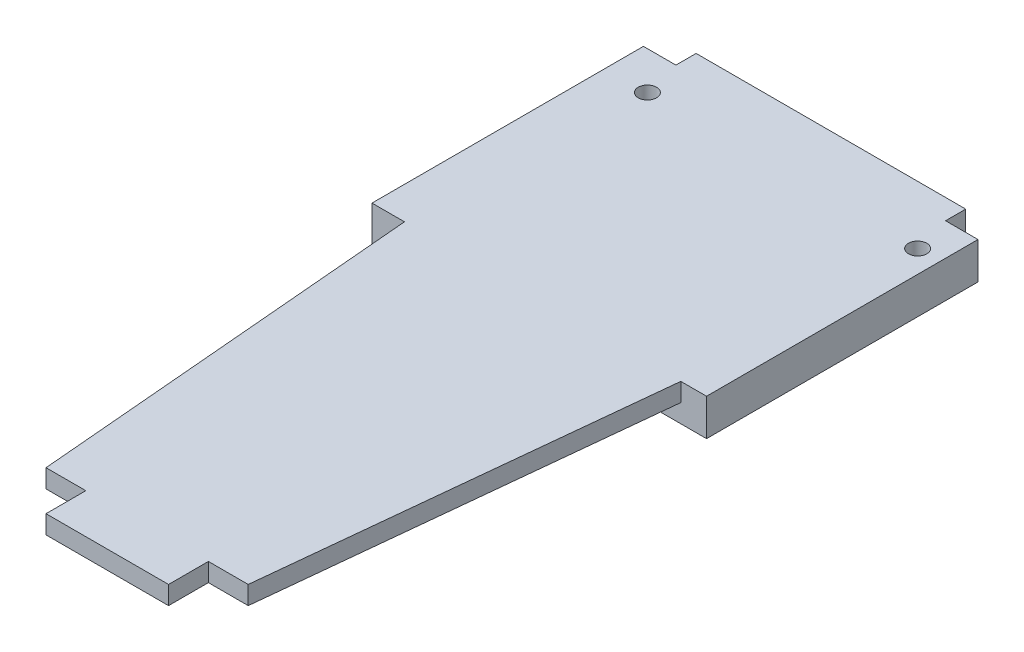
ISO-10303-21;
HEADER;
FILE_DESCRIPTION(('STEP AP214'),'2;1');
FILE_NAME('part.step','',(''),(''),'','','');
FILE_SCHEMA(('AUTOMOTIVE_DESIGN { 1 0 10303 214 1 1 1 1 }'));
ENDSEC;
DATA;
#1=APPLICATION_CONTEXT('core data for automotive mechanical design processes');
#2=APPLICATION_PROTOCOL_DEFINITION('international standard','automotive_design',2000,#1);
#3=PRODUCT_CONTEXT('',#1,'mechanical');
#4=PRODUCT('Part','Part','',(#3));
#5=PRODUCT_RELATED_PRODUCT_CATEGORY('part','',(#4));
#6=PRODUCT_DEFINITION_FORMATION('','',#4);
#7=PRODUCT_DEFINITION_CONTEXT('part definition',#1,'design');
#8=PRODUCT_DEFINITION('design','',#6,#7);
#9=PRODUCT_DEFINITION_SHAPE('','',#8);
#10=(LENGTH_UNIT() NAMED_UNIT(*) SI_UNIT(.MILLI.,.METRE.));
#11=(NAMED_UNIT(*) PLANE_ANGLE_UNIT() SI_UNIT($,.RADIAN.));
#12=(NAMED_UNIT(*) SI_UNIT($,.STERADIAN.) SOLID_ANGLE_UNIT());
#13=UNCERTAINTY_MEASURE_WITH_UNIT(LENGTH_MEASURE(1.E-05),#10,'distance_accuracy_value','');
#14=(GEOMETRIC_REPRESENTATION_CONTEXT(3) GLOBAL_UNCERTAINTY_ASSIGNED_CONTEXT((#13)) GLOBAL_UNIT_ASSIGNED_CONTEXT((#10,
#11,#12)) REPRESENTATION_CONTEXT('',''));
#15=CARTESIAN_POINT('',(0.,0.,0.));
#16=DIRECTION('',(0.,0.,1.));
#17=DIRECTION('',(1.,0.,0.));
#18=AXIS2_PLACEMENT_3D('',#15,#16,#17);
#19=CARTESIAN_POINT('',(22.,3.,0.));
#20=DIRECTION('',(1.,0.,0.));
#21=DIRECTION('',(0.,0.,-1.));
#22=AXIS2_PLACEMENT_3D('',#19,#20,#21);
#23=PLANE('',#22);
#24=DIRECTION('',(0.,-1.,0.));
#25=VECTOR('',#24,1.);
#26=CARTESIAN_POINT('',(22.,3.,-108.3));
#27=LINE('',#26,#25);
#28=CARTESIAN_POINT('',(22.,3.,-108.3));
#29=VERTEX_POINT('',#28);
#30=CARTESIAN_POINT('',(22.,-3.,-108.3));
#31=VERTEX_POINT('',#30);
#32=EDGE_CURVE('E60',#29,#31,#27,.T.);
#33=ORIENTED_EDGE('',*,*,#32,.T.);
#34=DIRECTION('',(0.,0.,1.));
#35=VECTOR('',#34,1.);
#36=CARTESIAN_POINT('',(22.,-3.,0.));
#37=LINE('',#36,#35);
#38=CARTESIAN_POINT('',(22.,-3.,-111.6));
#39=VERTEX_POINT('',#38);
#40=EDGE_CURVE('E244',#39,#31,#37,.T.);
#41=ORIENTED_EDGE('',*,*,#40,.F.);
#42=DIRECTION('',(0.,-1.,0.));
#43=VECTOR('',#42,1.);
#44=CARTESIAN_POINT('',(22.,3.,-111.6));
#45=LINE('',#44,#43);
#46=CARTESIAN_POINT('',(22.,3.,-111.6));
#47=VERTEX_POINT('',#46);
#48=EDGE_CURVE('E46',#47,#39,#45,.T.);
#49=ORIENTED_EDGE('',*,*,#48,.F.);
#50=DIRECTION('',(0.,0.,1.));
#51=VECTOR('',#50,1.);
#52=CARTESIAN_POINT('',(22.,3.,0.));
#53=LINE('',#52,#51);
#54=EDGE_CURVE('E193',#47,#29,#53,.T.);
#55=ORIENTED_EDGE('',*,*,#54,.T.);
#56=EDGE_LOOP('',(#33,#41,#49,#55));
#57=FACE_BOUND('',#56,.T.);
#58=ADVANCED_FACE('F43',(#57),#23,.T.);
#59=CARTESIAN_POINT('',(0.,3.,-111.6));
#60=DIRECTION('',(0.,0.,-1.));
#61=DIRECTION('',(-1.,0.,0.));
#62=AXIS2_PLACEMENT_3D('',#59,#60,#61);
#63=PLANE('',#62);
#64=ORIENTED_EDGE('',*,*,#48,.T.);
#65=DIRECTION('',(1.,0.,0.));
#66=VECTOR('',#65,1.);
#67=CARTESIAN_POINT('',(0.,-3.,-111.6));
#68=LINE('',#67,#66);
#69=CARTESIAN_POINT('',(-22.,-3.,-111.6));
#70=VERTEX_POINT('',#69);
#71=EDGE_CURVE('E234',#70,#39,#68,.T.);
#72=ORIENTED_EDGE('',*,*,#71,.F.);
#73=DIRECTION('',(0.,-1.,0.));
#74=VECTOR('',#73,1.);
#75=CARTESIAN_POINT('',(-22.,3.,-111.6));
#76=LINE('',#75,#74);
#77=CARTESIAN_POINT('',(-22.,3.,-111.6));
#78=VERTEX_POINT('',#77);
#79=EDGE_CURVE('E221',#78,#70,#76,.T.);
#80=ORIENTED_EDGE('',*,*,#79,.F.);
#81=DIRECTION('',(1.,0.,0.));
#82=VECTOR('',#81,1.);
#83=CARTESIAN_POINT('',(0.,3.,-111.6));
#84=LINE('',#83,#82);
#85=EDGE_CURVE('E236',#78,#47,#84,.T.);
#86=ORIENTED_EDGE('',*,*,#85,.T.);
#87=EDGE_LOOP('',(#64,#72,#80,#86));
#88=FACE_BOUND('',#87,.T.);
#89=ADVANCED_FACE('F233',(#88),#63,.T.);
#90=CARTESIAN_POINT('',(-22.,3.,0.));
#91=DIRECTION('',(1.,0.,0.));
#92=DIRECTION('',(0.,0.,-1.));
#93=AXIS2_PLACEMENT_3D('',#90,#91,#92);
#94=PLANE('',#93);
#95=ORIENTED_EDGE('',*,*,#79,.T.);
#96=DIRECTION('',(0.,0.,-1.));
#97=VECTOR('',#96,1.);
#98=CARTESIAN_POINT('',(-22.,-3.,0.));
#99=LINE('',#98,#97);
#100=CARTESIAN_POINT('',(-22.,-3.,-108.3));
#101=VERTEX_POINT('',#100);
#102=EDGE_CURVE('E246',#101,#70,#99,.T.);
#103=ORIENTED_EDGE('',*,*,#102,.F.);
#104=DIRECTION('',(0.,-1.,0.));
#105=VECTOR('',#104,1.);
#106=CARTESIAN_POINT('',(-22.,3.,-108.3));
#107=LINE('',#106,#105);
#108=CARTESIAN_POINT('',(-22.,3.,-108.3));
#109=VERTEX_POINT('',#108);
#110=EDGE_CURVE('E219',#109,#101,#107,.T.);
#111=ORIENTED_EDGE('',*,*,#110,.F.);
#112=DIRECTION('',(0.,0.,1.));
#113=VECTOR('',#112,1.);
#114=CARTESIAN_POINT('',(-22.,3.,0.));
#115=LINE('',#114,#113);
#116=EDGE_CURVE('E268',#78,#109,#115,.T.);
#117=ORIENTED_EDGE('',*,*,#116,.F.);
#118=EDGE_LOOP('',(#95,#103,#111,#117));
#119=FACE_BOUND('',#118,.T.);
#120=ADVANCED_FACE('F320',(#119),#94,.F.);
#121=CARTESIAN_POINT('',(0.,3.,-108.3));
#122=DIRECTION('',(0.,0.,-1.));
#123=DIRECTION('',(-1.,0.,0.));
#124=AXIS2_PLACEMENT_3D('',#121,#122,#123);
#125=PLANE('',#124);
#126=ORIENTED_EDGE('',*,*,#110,.T.);
#127=DIRECTION('',(1.,0.,0.));
#128=VECTOR('',#127,1.);
#129=CARTESIAN_POINT('',(0.,-3.,-108.3));
#130=LINE('',#129,#128);
#131=CARTESIAN_POINT('',(-27.3,-3.,-108.3));
#132=VERTEX_POINT('',#131);
#133=EDGE_CURVE('E314',#132,#101,#130,.T.);
#134=ORIENTED_EDGE('',*,*,#133,.F.);
#135=DIRECTION('',(0.,-1.,0.));
#136=VECTOR('',#135,1.);
#137=CARTESIAN_POINT('',(-27.3,3.,-108.3));
#138=LINE('',#137,#136);
#139=CARTESIAN_POINT('',(-27.3,3.,-108.3));
#140=VERTEX_POINT('',#139);
#141=EDGE_CURVE('E216',#140,#132,#138,.T.);
#142=ORIENTED_EDGE('',*,*,#141,.F.);
#143=DIRECTION('',(1.,0.,0.));
#144=VECTOR('',#143,1.);
#145=CARTESIAN_POINT('',(0.,3.,-108.3));
#146=LINE('',#145,#144);
#147=EDGE_CURVE('E174',#140,#109,#146,.T.);
#148=ORIENTED_EDGE('',*,*,#147,.T.);
#149=EDGE_LOOP('',(#126,#134,#142,#148));
#150=FACE_BOUND('',#149,.T.);
#151=ADVANCED_FACE('F322',(#150),#125,.T.);
#152=CARTESIAN_POINT('',(-27.3,3.,0.));
#153=DIRECTION('',(-1.,0.,0.));
#154=DIRECTION('',(0.,0.,1.));
#155=AXIS2_PLACEMENT_3D('',#152,#153,#154);
#156=PLANE('',#155);
#157=ORIENTED_EDGE('',*,*,#141,.T.);
#158=DIRECTION('',(0.,0.,-1.));
#159=VECTOR('',#158,1.);
#160=CARTESIAN_POINT('',(-27.3,-3.,0.));
#161=LINE('',#160,#159);
#162=CARTESIAN_POINT('',(-27.3,-3.,-64.));
#163=VERTEX_POINT('',#162);
#164=EDGE_CURVE('E311',#163,#132,#161,.T.);
#165=ORIENTED_EDGE('',*,*,#164,.F.);
#166=DIRECTION('',(0.,-1.,0.));
#167=VECTOR('',#166,1.);
#168=CARTESIAN_POINT('',(-27.3,3.,-64.));
#169=LINE('',#168,#167);
#170=CARTESIAN_POINT('',(-27.3,3.,-64.));
#171=VERTEX_POINT('',#170);
#172=EDGE_CURVE('E214',#171,#163,#169,.T.);
#173=ORIENTED_EDGE('',*,*,#172,.F.);
#174=DIRECTION('',(0.,0.,-1.));
#175=VECTOR('',#174,1.);
#176=CARTESIAN_POINT('',(-27.3,3.,0.));
#177=LINE('',#176,#175);
#178=EDGE_CURVE('E271',#171,#140,#177,.T.);
#179=ORIENTED_EDGE('',*,*,#178,.T.);
#180=EDGE_LOOP('',(#157,#165,#173,#179));
#181=FACE_BOUND('',#180,.T.);
#182=ADVANCED_FACE('F312',(#181),#156,.T.);
#183=CARTESIAN_POINT('',(-16.3790366555589,3.,1.40757346258709));
#184=DIRECTION('',(-0.996327701218676,0.,0.08562191182348));
#185=DIRECTION('',(0.08562191182348,0.,0.996327701218677));
#186=AXIS2_PLACEMENT_3D('',#183,#184,#185);
#187=PLANE('',#186);
#188=DIRECTION('',(-0.08562191182348,0.,-0.996327701218677));
#189=VECTOR('',#188,1.);
#190=CARTESIAN_POINT('',(-16.3790366555589,0.,1.40757346258709));
#191=LINE('',#190,#189);
#192=CARTESIAN_POINT('',(-16.5,0.,0.));
#193=VERTEX_POINT('',#192);
#194=CARTESIAN_POINT('',(-22.,0.,-64.));
#195=VERTEX_POINT('',#194);
#196=EDGE_CURVE('E178',#193,#195,#191,.T.);
#197=ORIENTED_EDGE('',*,*,#196,.F.);
#198=DIRECTION('',(0.,-1.,0.));
#199=VECTOR('',#198,1.);
#200=CARTESIAN_POINT('',(-16.5,3.,0.));
#201=LINE('',#200,#199);
#202=CARTESIAN_POINT('',(-16.5,3.,0.));
#203=VERTEX_POINT('',#202);
#204=EDGE_CURVE('E209',#203,#193,#201,.T.);
#205=ORIENTED_EDGE('',*,*,#204,.F.);
#206=DIRECTION('',(-0.08562191182348,0.,-0.996327701218677));
#207=VECTOR('',#206,1.);
#208=CARTESIAN_POINT('',(-16.3790366555589,3.,1.40757346258709));
#209=LINE('',#208,#207);
#210=CARTESIAN_POINT('',(-22.,3.,-64.));
#211=VERTEX_POINT('',#210);
#212=EDGE_CURVE('E274',#203,#211,#209,.T.);
#213=ORIENTED_EDGE('',*,*,#212,.T.);
#214=DIRECTION('',(0.,-1.,0.));
#215=VECTOR('',#214,1.);
#216=CARTESIAN_POINT('',(-22.,3.,-64.));
#217=LINE('',#216,#215);
#218=EDGE_CURVE('E211',#211,#195,#217,.T.);
#219=ORIENTED_EDGE('',*,*,#218,.T.);
#220=EDGE_LOOP('',(#197,#205,#213,#219));
#221=FACE_BOUND('',#220,.T.);
#222=ADVANCED_FACE('F348',(#221),#187,.T.);
#223=CARTESIAN_POINT('',(0.,3.,0.));
#224=DIRECTION('',(0.,0.,-1.));
#225=DIRECTION('',(-1.,0.,0.));
#226=AXIS2_PLACEMENT_3D('',#223,#224,#225);
#227=PLANE('',#226);
#228=DIRECTION('',(1.,0.,0.));
#229=VECTOR('',#228,1.);
#230=CARTESIAN_POINT('',(0.,0.,0.));
#231=LINE('',#230,#229);
#232=CARTESIAN_POINT('',(-10.,0.,0.));
#233=VERTEX_POINT('',#232);
#234=EDGE_CURVE('E181',#193,#233,#231,.T.);
#235=ORIENTED_EDGE('',*,*,#234,.T.);
#236=DIRECTION('',(0.,-1.,0.));
#237=VECTOR('',#236,1.);
#238=CARTESIAN_POINT('',(-10.,3.,0.));
#239=LINE('',#238,#237);
#240=CARTESIAN_POINT('',(-10.,3.,0.));
#241=VERTEX_POINT('',#240);
#242=EDGE_CURVE('E206',#241,#233,#239,.T.);
#243=ORIENTED_EDGE('',*,*,#242,.F.);
#244=DIRECTION('',(1.,0.,0.));
#245=VECTOR('',#244,1.);
#246=CARTESIAN_POINT('',(0.,3.,0.));
#247=LINE('',#246,#245);
#248=EDGE_CURVE('E277',#203,#241,#247,.T.);
#249=ORIENTED_EDGE('',*,*,#248,.F.);
#250=ORIENTED_EDGE('',*,*,#204,.T.);
#251=EDGE_LOOP('',(#235,#243,#249,#250));
#252=FACE_BOUND('',#251,.T.);
#253=ADVANCED_FACE('F351',(#252),#227,.F.);
#254=CARTESIAN_POINT('',(-10.,3.,0.));
#255=DIRECTION('',(1.,0.,0.));
#256=DIRECTION('',(0.,0.,-1.));
#257=AXIS2_PLACEMENT_3D('',#254,#255,#256);
#258=PLANE('',#257);
#259=DIRECTION('',(0.,0.,1.));
#260=VECTOR('',#259,1.);
#261=CARTESIAN_POINT('',(-10.,0.,0.));
#262=LINE('',#261,#260);
#263=CARTESIAN_POINT('',(-10.,0.,6.5));
#264=VERTEX_POINT('',#263);
#265=EDGE_CURVE('E184',#233,#264,#262,.T.);
#266=ORIENTED_EDGE('',*,*,#265,.T.);
#267=DIRECTION('',(0.,-1.,0.));
#268=VECTOR('',#267,1.);
#269=CARTESIAN_POINT('',(-10.,3.,6.5));
#270=LINE('',#269,#268);
#271=CARTESIAN_POINT('',(-10.,3.,6.5));
#272=VERTEX_POINT('',#271);
#273=EDGE_CURVE('E203',#272,#264,#270,.T.);
#274=ORIENTED_EDGE('',*,*,#273,.F.);
#275=DIRECTION('',(0.,0.,1.));
#276=VECTOR('',#275,1.);
#277=CARTESIAN_POINT('',(-10.,3.,0.));
#278=LINE('',#277,#276);
#279=EDGE_CURVE('E279',#241,#272,#278,.T.);
#280=ORIENTED_EDGE('',*,*,#279,.F.);
#281=ORIENTED_EDGE('',*,*,#242,.T.);
#282=EDGE_LOOP('',(#266,#274,#280,#281));
#283=FACE_BOUND('',#282,.T.);
#284=ADVANCED_FACE('F355',(#283),#258,.F.);
#285=CARTESIAN_POINT('',(0.,3.,6.5));
#286=DIRECTION('',(0.,0.,-1.));
#287=DIRECTION('',(-1.,0.,0.));
#288=AXIS2_PLACEMENT_3D('',#285,#286,#287);
#289=PLANE('',#288);
#290=DIRECTION('',(1.,0.,0.));
#291=VECTOR('',#290,1.);
#292=CARTESIAN_POINT('',(0.,0.,6.5));
#293=LINE('',#292,#291);
#294=CARTESIAN_POINT('',(10.,0.,6.5));
#295=VERTEX_POINT('',#294);
#296=EDGE_CURVE('E186',#264,#295,#293,.T.);
#297=ORIENTED_EDGE('',*,*,#296,.T.);
#298=DIRECTION('',(0.,-1.,0.));
#299=VECTOR('',#298,1.);
#300=CARTESIAN_POINT('',(10.,3.,6.5));
#301=LINE('',#300,#299);
#302=CARTESIAN_POINT('',(10.,3.,6.5));
#303=VERTEX_POINT('',#302);
#304=EDGE_CURVE('E201',#303,#295,#301,.T.);
#305=ORIENTED_EDGE('',*,*,#304,.F.);
#306=DIRECTION('',(1.,0.,0.));
#307=VECTOR('',#306,1.);
#308=CARTESIAN_POINT('',(0.,3.,6.5));
#309=LINE('',#308,#307);
#310=EDGE_CURVE('E281',#272,#303,#309,.T.);
#311=ORIENTED_EDGE('',*,*,#310,.F.);
#312=ORIENTED_EDGE('',*,*,#273,.T.);
#313=EDGE_LOOP('',(#297,#305,#311,#312));
#314=FACE_BOUND('',#313,.T.);
#315=ADVANCED_FACE('F359',(#314),#289,.F.);
#316=CARTESIAN_POINT('',(10.,3.,0.));
#317=DIRECTION('',(-1.,0.,0.));
#318=DIRECTION('',(0.,0.,1.));
#319=AXIS2_PLACEMENT_3D('',#316,#317,#318);
#320=PLANE('',#319);
#321=DIRECTION('',(0.,0.,-1.));
#322=VECTOR('',#321,1.);
#323=CARTESIAN_POINT('',(10.,0.,0.));
#324=LINE('',#323,#322);
#325=CARTESIAN_POINT('',(10.,0.,0.));
#326=VERTEX_POINT('',#325);
#327=EDGE_CURVE('E85',#295,#326,#324,.T.);
#328=ORIENTED_EDGE('',*,*,#327,.T.);
#329=DIRECTION('',(0.,-1.,0.));
#330=VECTOR('',#329,1.);
#331=CARTESIAN_POINT('',(10.,3.,0.));
#332=LINE('',#331,#330);
#333=CARTESIAN_POINT('',(10.,3.,0.));
#334=VERTEX_POINT('',#333);
#335=EDGE_CURVE('E199',#334,#326,#332,.T.);
#336=ORIENTED_EDGE('',*,*,#335,.F.);
#337=DIRECTION('',(0.,0.,-1.));
#338=VECTOR('',#337,1.);
#339=CARTESIAN_POINT('',(10.,3.,0.));
#340=LINE('',#339,#338);
#341=EDGE_CURVE('E283',#303,#334,#340,.T.);
#342=ORIENTED_EDGE('',*,*,#341,.F.);
#343=ORIENTED_EDGE('',*,*,#304,.T.);
#344=EDGE_LOOP('',(#328,#336,#342,#343));
#345=FACE_BOUND('',#344,.T.);
#346=ADVANCED_FACE('F363',(#345),#320,.F.);
#347=CARTESIAN_POINT('',(0.,3.,0.));
#348=DIRECTION('',(0.,0.,-1.));
#349=DIRECTION('',(-1.,0.,0.));
#350=AXIS2_PLACEMENT_3D('',#347,#348,#349);
#351=PLANE('',#350);
#352=DIRECTION('',(1.,0.,0.));
#353=VECTOR('',#352,1.);
#354=CARTESIAN_POINT('',(0.,0.,0.));
#355=LINE('',#354,#353);
#356=CARTESIAN_POINT('',(16.5,0.,0.));
#357=VERTEX_POINT('',#356);
#358=EDGE_CURVE('E92',#326,#357,#355,.T.);
#359=ORIENTED_EDGE('',*,*,#358,.T.);
#360=DIRECTION('',(0.,-1.,0.));
#361=VECTOR('',#360,1.);
#362=CARTESIAN_POINT('',(16.5,3.,0.));
#363=LINE('',#362,#361);
#364=CARTESIAN_POINT('',(16.5,3.,0.));
#365=VERTEX_POINT('',#364);
#366=EDGE_CURVE('E197',#365,#357,#363,.T.);
#367=ORIENTED_EDGE('',*,*,#366,.F.);
#368=DIRECTION('',(1.,0.,0.));
#369=VECTOR('',#368,1.);
#370=CARTESIAN_POINT('',(0.,3.,0.));
#371=LINE('',#370,#369);
#372=EDGE_CURVE('E284',#334,#365,#371,.T.);
#373=ORIENTED_EDGE('',*,*,#372,.F.);
#374=ORIENTED_EDGE('',*,*,#335,.T.);
#375=EDGE_LOOP('',(#359,#367,#373,#374));
#376=FACE_BOUND('',#375,.T.);
#377=ADVANCED_FACE('F287',(#376),#351,.F.);
#378=CARTESIAN_POINT('',(16.3263728512209,3.,1.68365720028216));
#379=DIRECTION('',(-0.994724656625258,0.,-0.10258098021448));
#380=DIRECTION('',(-0.10258098021448,0.,0.994724656625258));
#381=AXIS2_PLACEMENT_3D('',#378,#379,#380);
#382=PLANE('',#381);
#383=DIRECTION('',(0.10258098021448,0.,-0.994724656625258));
#384=VECTOR('',#383,1.);
#385=CARTESIAN_POINT('',(16.3263728512209,0.,1.68365720028216));
#386=LINE('',#385,#384);
#387=CARTESIAN_POINT('',(23.1,0.,-64.));
#388=VERTEX_POINT('',#387);
#389=EDGE_CURVE('E190',#357,#388,#386,.T.);
#390=ORIENTED_EDGE('',*,*,#389,.T.);
#391=DIRECTION('',(0.,-1.,0.));
#392=VECTOR('',#391,1.);
#393=CARTESIAN_POINT('',(23.1,3.,-64.));
#394=LINE('',#393,#392);
#395=CARTESIAN_POINT('',(23.1,3.,-64.));
#396=VERTEX_POINT('',#395);
#397=EDGE_CURVE('E166',#396,#388,#394,.T.);
#398=ORIENTED_EDGE('',*,*,#397,.F.);
#399=DIRECTION('',(0.10258098021448,0.,-0.994724656625258));
#400=VECTOR('',#399,1.);
#401=CARTESIAN_POINT('',(16.3263728512209,3.,1.68365720028216));
#402=LINE('',#401,#400);
#403=EDGE_CURVE('E149',#365,#396,#402,.T.);
#404=ORIENTED_EDGE('',*,*,#403,.F.);
#405=ORIENTED_EDGE('',*,*,#366,.T.);
#406=EDGE_LOOP('',(#390,#398,#404,#405));
#407=FACE_BOUND('',#406,.T.);
#408=ADVANCED_FACE('F290',(#407),#382,.F.);
#409=CARTESIAN_POINT('',(0.,3.,-64.));
#410=DIRECTION('',(0.,0.,-1.));
#411=DIRECTION('',(-1.,0.,0.));
#412=AXIS2_PLACEMENT_3D('',#409,#410,#411);
#413=PLANE('',#412);
#414=ORIENTED_EDGE('',*,*,#397,.T.);
#415=DIRECTION('',(1.,0.,0.));
#416=VECTOR('',#415,1.);
#417=CARTESIAN_POINT('',(0.,0.,-64.));
#418=LINE('',#417,#416);
#419=EDGE_CURVE('E11',#195,#388,#418,.T.);
#420=ORIENTED_EDGE('',*,*,#419,.F.);
#421=ORIENTED_EDGE('',*,*,#218,.F.);
#422=DIRECTION('',(1.,0.,0.));
#423=VECTOR('',#422,1.);
#424=CARTESIAN_POINT('',(0.,3.,-64.));
#425=LINE('',#424,#423);
#426=EDGE_CURVE('E154',#171,#211,#425,.T.);
#427=ORIENTED_EDGE('',*,*,#426,.F.);
#428=ORIENTED_EDGE('',*,*,#172,.T.);
#429=DIRECTION('',(1.,0.,0.));
#430=VECTOR('',#429,1.);
#431=CARTESIAN_POINT('',(0.,-3.,-64.));
#432=LINE('',#431,#430);
#433=CARTESIAN_POINT('',(27.3,-3.,-64.));
#434=VERTEX_POINT('',#433);
#435=EDGE_CURVE('E162',#163,#434,#432,.T.);
#436=ORIENTED_EDGE('',*,*,#435,.T.);
#437=DIRECTION('',(0.,-1.,0.));
#438=VECTOR('',#437,1.);
#439=CARTESIAN_POINT('',(27.3,3.,-64.));
#440=LINE('',#439,#438);
#441=CARTESIAN_POINT('',(27.3,3.,-64.));
#442=VERTEX_POINT('',#441);
#443=EDGE_CURVE('E157',#442,#434,#440,.T.);
#444=ORIENTED_EDGE('',*,*,#443,.F.);
#445=EDGE_CURVE('E141',#396,#442,#425,.T.);
#446=ORIENTED_EDGE('',*,*,#445,.F.);
#447=EDGE_LOOP('',(#414,#420,#421,#427,#428,#436,#444,#446));
#448=FACE_BOUND('',#447,.T.);
#449=ADVANCED_FACE('F158',(#448),#413,.F.);
#450=CARTESIAN_POINT('',(27.3,3.,0.));
#451=DIRECTION('',(-1.,0.,0.));
#452=DIRECTION('',(0.,0.,1.));
#453=AXIS2_PLACEMENT_3D('',#450,#451,#452);
#454=PLANE('',#453);
#455=ORIENTED_EDGE('',*,*,#443,.T.);
#456=DIRECTION('',(0.,0.,1.));
#457=VECTOR('',#456,1.);
#458=CARTESIAN_POINT('',(27.3,-3.,0.));
#459=LINE('',#458,#457);
#460=CARTESIAN_POINT('',(27.3,-3.,-108.3));
#461=VERTEX_POINT('',#460);
#462=EDGE_CURVE('E250',#461,#434,#459,.T.);
#463=ORIENTED_EDGE('',*,*,#462,.F.);
#464=DIRECTION('',(0.,-1.,0.));
#465=VECTOR('',#464,1.);
#466=CARTESIAN_POINT('',(27.3,3.,-108.3));
#467=LINE('',#466,#465);
#468=CARTESIAN_POINT('',(27.3,3.,-108.3));
#469=VERTEX_POINT('',#468);
#470=EDGE_CURVE('E167',#469,#461,#467,.T.);
#471=ORIENTED_EDGE('',*,*,#470,.F.);
#472=DIRECTION('',(0.,0.,-1.));
#473=VECTOR('',#472,1.);
#474=CARTESIAN_POINT('',(27.3,3.,0.));
#475=LINE('',#474,#473);
#476=EDGE_CURVE('E146',#442,#469,#475,.T.);
#477=ORIENTED_EDGE('',*,*,#476,.F.);
#478=EDGE_LOOP('',(#455,#463,#471,#477));
#479=FACE_BOUND('',#478,.T.);
#480=ADVANCED_FACE('F169',(#479),#454,.F.);
#481=ORIENTED_EDGE('',*,*,#470,.T.);
#482=DIRECTION('',(1.,0.,0.));
#483=VECTOR('',#482,1.);
#484=CARTESIAN_POINT('',(0.,-3.,-108.3));
#485=LINE('',#484,#483);
#486=EDGE_CURVE('E248',#31,#461,#485,.T.);
#487=ORIENTED_EDGE('',*,*,#486,.F.);
#488=ORIENTED_EDGE('',*,*,#32,.F.);
#489=EDGE_CURVE('E171',#29,#469,#146,.T.);
#490=ORIENTED_EDGE('',*,*,#489,.T.);
#491=EDGE_LOOP('',(#481,#487,#488,#490));
#492=FACE_BOUND('',#491,.T.);
#493=ADVANCED_FACE('F323',(#492),#125,.T.);
#494=CARTESIAN_POINT('',(0.,3.,0.));
#495=DIRECTION('',(0.,1.,0.));
#496=DIRECTION('',(0.,0.,1.));
#497=AXIS2_PLACEMENT_3D('',#494,#495,#496);
#498=PLANE('',#497);
#499=CARTESIAN_POINT('',(23.65,3.,-102.1));
#500=DIRECTION('',(0.,-1.,0.));
#501=DIRECTION('',(0.,0.,-1.));
#502=AXIS2_PLACEMENT_3D('',#499,#500,#501);
#503=CIRCLE('',#502,1.5);
#504=CARTESIAN_POINT('',(23.65,3.,-103.6));
#505=VERTEX_POINT('',#504);
#506=EDGE_CURVE('E182',#505,#505,#503,.T.);
#507=ORIENTED_EDGE('',*,*,#506,.T.);
#508=EDGE_LOOP('',(#507));
#509=FACE_BOUND('',#508,.T.);
#510=CARTESIAN_POINT('',(-20.45,3.,-102.1));
#511=DIRECTION('',(0.,-1.,0.));
#512=DIRECTION('',(0.,0.,-1.));
#513=AXIS2_PLACEMENT_3D('',#510,#511,#512);
#514=CIRCLE('',#513,1.5);
#515=CARTESIAN_POINT('',(-20.45,3.,-103.6));
#516=VERTEX_POINT('',#515);
#517=EDGE_CURVE('E260',#516,#516,#514,.T.);
#518=ORIENTED_EDGE('',*,*,#517,.T.);
#519=EDGE_LOOP('',(#518));
#520=FACE_BOUND('',#519,.T.);
#521=ORIENTED_EDGE('',*,*,#54,.F.);
#522=ORIENTED_EDGE('',*,*,#85,.F.);
#523=ORIENTED_EDGE('',*,*,#116,.T.);
#524=ORIENTED_EDGE('',*,*,#147,.F.);
#525=ORIENTED_EDGE('',*,*,#178,.F.);
#526=ORIENTED_EDGE('',*,*,#426,.T.);
#527=ORIENTED_EDGE('',*,*,#212,.F.);
#528=ORIENTED_EDGE('',*,*,#248,.T.);
#529=ORIENTED_EDGE('',*,*,#279,.T.);
#530=ORIENTED_EDGE('',*,*,#310,.T.);
#531=ORIENTED_EDGE('',*,*,#341,.T.);
#532=ORIENTED_EDGE('',*,*,#372,.T.);
#533=ORIENTED_EDGE('',*,*,#403,.T.);
#534=ORIENTED_EDGE('',*,*,#445,.T.);
#535=ORIENTED_EDGE('',*,*,#476,.T.);
#536=ORIENTED_EDGE('',*,*,#489,.F.);
#537=EDGE_LOOP('',(#521,#522,#523,#524,#525,#526,#527,#528,#529,#530,#531,#532,#533,#534,#535,#536));
#538=FACE_BOUND('',#537,.T.);
#539=ADVANCED_FACE('F143',(#509,#520,#538),#498,.T.);
#540=CARTESIAN_POINT('',(0.,0.,0.));
#541=DIRECTION('',(0.,1.,0.));
#542=DIRECTION('',(0.,0.,1.));
#543=AXIS2_PLACEMENT_3D('',#540,#541,#542);
#544=PLANE('',#543);
#545=ORIENTED_EDGE('',*,*,#196,.T.);
#546=ORIENTED_EDGE('',*,*,#419,.T.);
#547=ORIENTED_EDGE('',*,*,#389,.F.);
#548=ORIENTED_EDGE('',*,*,#358,.F.);
#549=ORIENTED_EDGE('',*,*,#327,.F.);
#550=ORIENTED_EDGE('',*,*,#296,.F.);
#551=ORIENTED_EDGE('',*,*,#265,.F.);
#552=ORIENTED_EDGE('',*,*,#234,.F.);
#553=EDGE_LOOP('',(#545,#546,#547,#548,#549,#550,#551,#552));
#554=FACE_BOUND('',#553,.T.);
#555=ADVANCED_FACE('F331',(#554),#544,.F.);
#556=CARTESIAN_POINT('',(-20.45,3.,-102.1));
#557=DIRECTION('',(0.,-1.,0.));
#558=DIRECTION('',(0.,0.,-1.));
#559=AXIS2_PLACEMENT_3D('',#556,#557,#558);
#560=CYLINDRICAL_SURFACE('',#559,1.5);
#561=ORIENTED_EDGE('',*,*,#517,.F.);
#562=EDGE_LOOP('',(#561));
#563=FACE_BOUND('',#562,.T.);
#564=CARTESIAN_POINT('',(-20.45,-3.,-102.1));
#565=DIRECTION('',(0.,-1.,0.));
#566=DIRECTION('',(0.,0.,-1.));
#567=AXIS2_PLACEMENT_3D('',#564,#565,#566);
#568=CIRCLE('',#567,1.5);
#569=CARTESIAN_POINT('',(-20.45,-3.,-103.6));
#570=VERTEX_POINT('',#569);
#571=EDGE_CURVE('E255',#570,#570,#568,.F.);
#572=ORIENTED_EDGE('',*,*,#571,.F.);
#573=EDGE_LOOP('',(#572));
#574=FACE_BOUND('',#573,.T.);
#575=ADVANCED_FACE('F398',(#563,#574),#560,.F.);
#576=CARTESIAN_POINT('',(23.65,3.,-102.1));
#577=DIRECTION('',(0.,-1.,0.));
#578=DIRECTION('',(0.,0.,-1.));
#579=AXIS2_PLACEMENT_3D('',#576,#577,#578);
#580=CYLINDRICAL_SURFACE('',#579,1.5);
#581=ORIENTED_EDGE('',*,*,#506,.F.);
#582=EDGE_LOOP('',(#581));
#583=FACE_BOUND('',#582,.T.);
#584=CARTESIAN_POINT('',(23.65,-3.,-102.1));
#585=DIRECTION('',(0.,-1.,0.));
#586=DIRECTION('',(0.,0.,-1.));
#587=AXIS2_PLACEMENT_3D('',#584,#585,#586);
#588=CIRCLE('',#587,1.5);
#589=CARTESIAN_POINT('',(23.65,-3.,-103.6));
#590=VERTEX_POINT('',#589);
#591=EDGE_CURVE('E258',#590,#590,#588,.F.);
#592=ORIENTED_EDGE('',*,*,#591,.F.);
#593=EDGE_LOOP('',(#592));
#594=FACE_BOUND('',#593,.T.);
#595=ADVANCED_FACE('F404',(#583,#594),#580,.F.);
#596=CARTESIAN_POINT('',(0.,-3.,0.));
#597=DIRECTION('',(0.,-1.,0.));
#598=DIRECTION('',(0.,0.,-1.));
#599=AXIS2_PLACEMENT_3D('',#596,#597,#598);
#600=PLANE('',#599);
#601=ORIENTED_EDGE('',*,*,#435,.F.);
#602=ORIENTED_EDGE('',*,*,#164,.T.);
#603=ORIENTED_EDGE('',*,*,#133,.T.);
#604=ORIENTED_EDGE('',*,*,#102,.T.);
#605=ORIENTED_EDGE('',*,*,#71,.T.);
#606=ORIENTED_EDGE('',*,*,#40,.T.);
#607=ORIENTED_EDGE('',*,*,#486,.T.);
#608=ORIENTED_EDGE('',*,*,#462,.T.);
#609=EDGE_LOOP('',(#601,#602,#603,#604,#605,#606,#607,#608));
#610=FACE_BOUND('',#609,.T.);
#611=ORIENTED_EDGE('',*,*,#571,.T.);
#612=EDGE_LOOP('',(#611));
#613=FACE_BOUND('',#612,.T.);
#614=ORIENTED_EDGE('',*,*,#591,.T.);
#615=EDGE_LOOP('',(#614));
#616=FACE_BOUND('',#615,.T.);
#617=ADVANCED_FACE('F241',(#610,#613,#616),#600,.T.);
#618=CLOSED_SHELL('',(#58,#89,#120,#151,#182,#222,#253,#284,#315,#346,#377,#408,#449,#480,#493,
#539,#555,#575,#595,#617));
#619=MANIFOLD_SOLID_BREP('B2',#618);
#620=ADVANCED_BREP_SHAPE_REPRESENTATION('',(#18,#619),#14);
#621=SHAPE_DEFINITION_REPRESENTATION(#9,#620);
ENDSEC;
END-ISO-10303-21;
